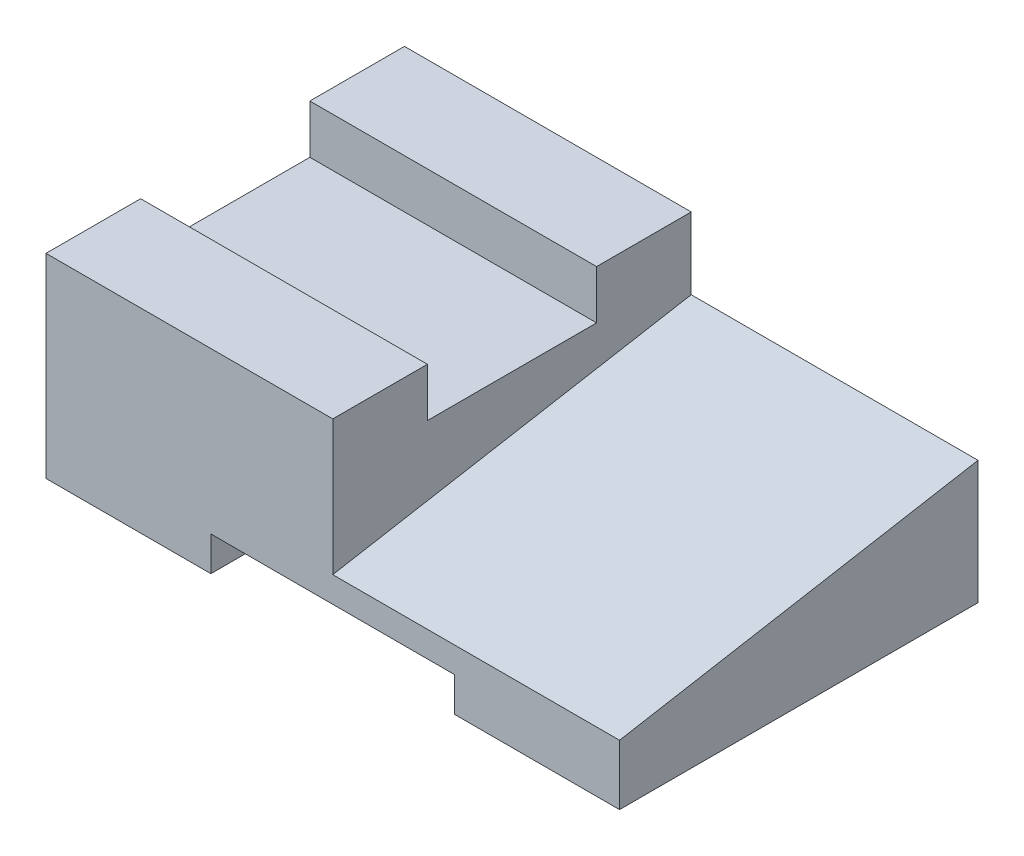
ISO-10303-21;
HEADER;
FILE_DESCRIPTION(('STEP AP214'),'2;1');
FILE_NAME('part.step','',(''),(''),'','','');
FILE_SCHEMA(('AUTOMOTIVE_DESIGN { 1 0 10303 214 1 1 1 1 }'));
ENDSEC;
DATA;
#1=APPLICATION_CONTEXT('core data for automotive mechanical design processes');
#2=APPLICATION_PROTOCOL_DEFINITION('international standard','automotive_design',2000,#1);
#3=PRODUCT_CONTEXT('',#1,'mechanical');
#4=PRODUCT('Part','Part','',(#3));
#5=PRODUCT_RELATED_PRODUCT_CATEGORY('part','',(#4));
#6=PRODUCT_DEFINITION_FORMATION('','',#4);
#7=PRODUCT_DEFINITION_CONTEXT('part definition',#1,'design');
#8=PRODUCT_DEFINITION('design','',#6,#7);
#9=PRODUCT_DEFINITION_SHAPE('','',#8);
#10=(LENGTH_UNIT() NAMED_UNIT(*) SI_UNIT(.MILLI.,.METRE.));
#11=(NAMED_UNIT(*) PLANE_ANGLE_UNIT() SI_UNIT($,.RADIAN.));
#12=(NAMED_UNIT(*) SI_UNIT($,.STERADIAN.) SOLID_ANGLE_UNIT());
#13=UNCERTAINTY_MEASURE_WITH_UNIT(LENGTH_MEASURE(1.E-05),#10,'distance_accuracy_value','');
#14=(GEOMETRIC_REPRESENTATION_CONTEXT(3) GLOBAL_UNCERTAINTY_ASSIGNED_CONTEXT((#13)) GLOBAL_UNIT_ASSIGNED_CONTEXT((#10,
#11,#12)) REPRESENTATION_CONTEXT('',''));
#15=CARTESIAN_POINT('',(0.,0.,0.));
#16=DIRECTION('',(0.,0.,1.));
#17=DIRECTION('',(1.,0.,0.));
#18=AXIS2_PLACEMENT_3D('',#15,#16,#17);
#19=CARTESIAN_POINT('',(-100.,0.,0.));
#20=DIRECTION('',(0.,-1.,0.));
#21=DIRECTION('',(0.,0.,-1.));
#22=AXIS2_PLACEMENT_3D('',#19,#20,#21);
#23=PLANE('',#22);
#24=DIRECTION('',(1.,0.,0.));
#25=VECTOR('',#24,1.);
#26=CARTESIAN_POINT('',(-100.,0.,0.));
#27=LINE('',#26,#25);
#28=CARTESIAN_POINT('',(42.5,0.,0.));
#29=VERTEX_POINT('',#28);
#30=CARTESIAN_POINT('',(100.,0.,0.));
#31=VERTEX_POINT('',#30);
#32=EDGE_CURVE('E287',#29,#31,#27,.T.);
#33=ORIENTED_EDGE('',*,*,#32,.F.);
#34=DIRECTION('',(0.,0.,-1.));
#35=VECTOR('',#34,1.);
#36=CARTESIAN_POINT('',(42.5,0.,348.070896452637));
#37=LINE('',#36,#35);
#38=CARTESIAN_POINT('',(42.5,0.,-125.));
#39=VERTEX_POINT('',#38);
#40=EDGE_CURVE('E211',#29,#39,#37,.T.);
#41=ORIENTED_EDGE('',*,*,#40,.T.);
#42=DIRECTION('',(1.,0.,0.));
#43=VECTOR('',#42,1.);
#44=CARTESIAN_POINT('',(-100.,0.,-125.));
#45=LINE('',#44,#43);
#46=CARTESIAN_POINT('',(100.,0.,-125.));
#47=VERTEX_POINT('',#46);
#48=EDGE_CURVE('E192',#39,#47,#45,.T.);
#49=ORIENTED_EDGE('',*,*,#48,.T.);
#50=DIRECTION('',(0.,0.,-1.));
#51=VECTOR('',#50,1.);
#52=CARTESIAN_POINT('',(100.,0.,0.));
#53=LINE('',#52,#51);
#54=EDGE_CURVE('E228',#31,#47,#53,.T.);
#55=ORIENTED_EDGE('',*,*,#54,.F.);
#56=EDGE_LOOP('',(#33,#41,#49,#55));
#57=FACE_BOUND('',#56,.T.);
#58=ADVANCED_FACE('F87',(#57),#23,.T.);
#59=CARTESIAN_POINT('',(-100.,0.,0.));
#60=DIRECTION('',(0.,0.,1.));
#61=DIRECTION('',(0.,-1.,0.));
#62=AXIS2_PLACEMENT_3D('',#59,#60,#61);
#63=PLANE('',#62);
#64=DIRECTION('',(1.,0.,0.));
#65=VECTOR('',#64,1.);
#66=CARTESIAN_POINT('',(-42.5,12.,0.));
#67=LINE('',#66,#65);
#68=CARTESIAN_POINT('',(-42.5,12.,0.));
#69=VERTEX_POINT('',#68);
#70=CARTESIAN_POINT('',(42.5,12.,0.));
#71=VERTEX_POINT('',#70);
#72=EDGE_CURVE('E107',#69,#71,#67,.T.);
#73=ORIENTED_EDGE('',*,*,#72,.T.);
#74=DIRECTION('',(0.,-1.,0.));
#75=VECTOR('',#74,1.);
#76=CARTESIAN_POINT('',(42.5,12.,0.));
#77=LINE('',#76,#75);
#78=EDGE_CURVE('E209',#71,#29,#77,.T.);
#79=ORIENTED_EDGE('',*,*,#78,.T.);
#80=ORIENTED_EDGE('',*,*,#32,.T.);
#81=DIRECTION('',(0.,-1.,0.));
#82=VECTOR('',#81,1.);
#83=CARTESIAN_POINT('',(100.,0.,0.));
#84=LINE('',#83,#82);
#85=CARTESIAN_POINT('',(100.,20.9591274114428,0.));
#86=VERTEX_POINT('',#85);
#87=EDGE_CURVE('E224',#86,#31,#84,.T.);
#88=ORIENTED_EDGE('',*,*,#87,.F.);
#89=DIRECTION('',(-1.,0.,0.));
#90=VECTOR('',#89,1.);
#91=CARTESIAN_POINT('',(100.,20.9591274114428,0.));
#92=LINE('',#91,#90);
#93=CARTESIAN_POINT('',(0.,20.9591274114428,0.));
#94=VERTEX_POINT('',#93);
#95=EDGE_CURVE('E230',#86,#94,#92,.T.);
#96=ORIENTED_EDGE('',*,*,#95,.T.);
#97=DIRECTION('',(0.,-1.,0.));
#98=VECTOR('',#97,1.);
#99=CARTESIAN_POINT('',(0.,0.,0.));
#100=LINE('',#99,#98);
#101=CARTESIAN_POINT('',(0.,68.,0.));
#102=VERTEX_POINT('',#101);
#103=EDGE_CURVE('E244',#102,#94,#100,.T.);
#104=ORIENTED_EDGE('',*,*,#103,.F.);
#105=DIRECTION('',(1.,0.,0.));
#106=VECTOR('',#105,1.);
#107=CARTESIAN_POINT('',(-100.,68.,0.));
#108=LINE('',#107,#106);
#109=CARTESIAN_POINT('',(-100.,68.,0.));
#110=VERTEX_POINT('',#109);
#111=EDGE_CURVE('E12',#110,#102,#108,.T.);
#112=ORIENTED_EDGE('',*,*,#111,.F.);
#113=DIRECTION('',(0.,-1.,0.));
#114=VECTOR('',#113,1.);
#115=CARTESIAN_POINT('',(-100.,0.,0.));
#116=LINE('',#115,#114);
#117=CARTESIAN_POINT('',(-100.,0.,0.));
#118=VERTEX_POINT('',#117);
#119=EDGE_CURVE('E260',#110,#118,#116,.T.);
#120=ORIENTED_EDGE('',*,*,#119,.T.);
#121=CARTESIAN_POINT('',(-42.5,0.,0.));
#122=VERTEX_POINT('',#121);
#123=EDGE_CURVE('E93',#118,#122,#27,.T.);
#124=ORIENTED_EDGE('',*,*,#123,.T.);
#125=DIRECTION('',(0.,1.,0.));
#126=VECTOR('',#125,1.);
#127=CARTESIAN_POINT('',(-42.5,0.,0.));
#128=LINE('',#127,#126);
#129=EDGE_CURVE('E102',#122,#69,#128,.T.);
#130=ORIENTED_EDGE('',*,*,#129,.T.);
#131=EDGE_LOOP('',(#73,#79,#80,#88,#96,#104,#112,#120,#124,#130));
#132=FACE_BOUND('',#131,.T.);
#133=ADVANCED_FACE('F300',(#132),#63,.T.);
#134=CARTESIAN_POINT('',(-100.,68.,0.));
#135=DIRECTION('',(0.,1.,0.));
#136=DIRECTION('',(0.,0.,1.));
#137=AXIS2_PLACEMENT_3D('',#134,#135,#136);
#138=PLANE('',#137);
#139=DIRECTION('',(0.,0.,1.));
#140=VECTOR('',#139,1.);
#141=CARTESIAN_POINT('',(0.,68.,0.));
#142=LINE('',#141,#140);
#143=CARTESIAN_POINT('',(0.,68.,-33.));
#144=VERTEX_POINT('',#143);
#145=EDGE_CURVE('E274',#144,#102,#142,.T.);
#146=ORIENTED_EDGE('',*,*,#145,.F.);
#147=DIRECTION('',(1.,0.,0.));
#148=VECTOR('',#147,1.);
#149=CARTESIAN_POINT('',(-100.,68.,-33.));
#150=LINE('',#149,#148);
#151=CARTESIAN_POINT('',(-100.,68.,-33.));
#152=VERTEX_POINT('',#151);
#153=EDGE_CURVE('E96',#152,#144,#150,.T.);
#154=ORIENTED_EDGE('',*,*,#153,.F.);
#155=DIRECTION('',(0.,0.,1.));
#156=VECTOR('',#155,1.);
#157=CARTESIAN_POINT('',(-100.,68.,0.));
#158=LINE('',#157,#156);
#159=EDGE_CURVE('E255',#152,#110,#158,.T.);
#160=ORIENTED_EDGE('',*,*,#159,.T.);
#161=ORIENTED_EDGE('',*,*,#111,.T.);
#162=EDGE_LOOP('',(#146,#154,#160,#161));
#163=FACE_BOUND('',#162,.T.);
#164=ADVANCED_FACE('F306',(#163),#138,.T.);
#165=CARTESIAN_POINT('',(0.,0.,0.));
#166=DIRECTION('',(1.,0.,0.));
#167=DIRECTION('',(0.,0.,-1.));
#168=AXIS2_PLACEMENT_3D('',#165,#166,#167);
#169=PLANE('',#168);
#170=DIRECTION('',(0.,-0.173648177666924,0.984807753012209));
#171=VECTOR('',#170,1.);
#172=CARTESIAN_POINT('',(0.,20.3271323890436,3.58422188062117));
#173=LINE('',#172,#171);
#174=CARTESIAN_POINT('',(0.,43.,-125.));
#175=VERTEX_POINT('',#174);
#176=EDGE_CURVE('E222',#175,#94,#173,.T.);
#177=ORIENTED_EDGE('',*,*,#176,.F.);
#178=DIRECTION('',(0.,1.,0.));
#179=VECTOR('',#178,1.);
#180=CARTESIAN_POINT('',(0.,0.,-125.));
#181=LINE('',#180,#179);
#182=CARTESIAN_POINT('',(0.,68.,-125.));
#183=VERTEX_POINT('',#182);
#184=EDGE_CURVE('E257',#175,#183,#181,.T.);
#185=ORIENTED_EDGE('',*,*,#184,.T.);
#186=DIRECTION('',(0.,0.,1.));
#187=VECTOR('',#186,1.);
#188=CARTESIAN_POINT('',(0.,68.,0.));
#189=LINE('',#188,#187);
#190=CARTESIAN_POINT('',(0.,68.,-92.));
#191=VERTEX_POINT('',#190);
#192=EDGE_CURVE('E265',#183,#191,#189,.T.);
#193=ORIENTED_EDGE('',*,*,#192,.T.);
#194=DIRECTION('',(0.,-1.,0.));
#195=VECTOR('',#194,1.);
#196=CARTESIAN_POINT('',(0.,0.,-92.));
#197=LINE('',#196,#195);
#198=CARTESIAN_POINT('',(0.,51.,-92.));
#199=VERTEX_POINT('',#198);
#200=EDGE_CURVE('E266',#191,#199,#197,.T.);
#201=ORIENTED_EDGE('',*,*,#200,.T.);
#202=DIRECTION('',(0.,0.,1.));
#203=VECTOR('',#202,1.);
#204=CARTESIAN_POINT('',(0.,51.,0.));
#205=LINE('',#204,#203);
#206=CARTESIAN_POINT('',(0.,51.,-33.));
#207=VERTEX_POINT('',#206);
#208=EDGE_CURVE('E267',#199,#207,#205,.T.);
#209=ORIENTED_EDGE('',*,*,#208,.T.);
#210=DIRECTION('',(0.,1.,0.));
#211=VECTOR('',#210,1.);
#212=CARTESIAN_POINT('',(0.,0.,-33.));
#213=LINE('',#212,#211);
#214=EDGE_CURVE('E275',#207,#144,#213,.T.);
#215=ORIENTED_EDGE('',*,*,#214,.T.);
#216=ORIENTED_EDGE('',*,*,#145,.T.);
#217=ORIENTED_EDGE('',*,*,#103,.T.);
#218=EDGE_LOOP('',(#177,#185,#193,#201,#209,#215,#216,#217));
#219=FACE_BOUND('',#218,.T.);
#220=ADVANCED_FACE('F309',(#219),#169,.T.);
#221=CARTESIAN_POINT('',(-100.,0.,-125.));
#222=DIRECTION('',(0.,0.,-1.));
#223=DIRECTION('',(-1.,0.,0.));
#224=AXIS2_PLACEMENT_3D('',#221,#222,#223);
#225=PLANE('',#224);
#226=DIRECTION('',(0.,1.,0.));
#227=VECTOR('',#226,1.);
#228=CARTESIAN_POINT('',(-42.5,0.,-125.));
#229=LINE('',#228,#227);
#230=CARTESIAN_POINT('',(-42.5,0.,-125.));
#231=VERTEX_POINT('',#230);
#232=CARTESIAN_POINT('',(-42.5,12.,-125.));
#233=VERTEX_POINT('',#232);
#234=EDGE_CURVE('E210',#231,#233,#229,.T.);
#235=ORIENTED_EDGE('',*,*,#234,.F.);
#236=CARTESIAN_POINT('',(-100.,0.,-125.));
#237=VERTEX_POINT('',#236);
#238=EDGE_CURVE('E263',#237,#231,#45,.T.);
#239=ORIENTED_EDGE('',*,*,#238,.F.);
#240=DIRECTION('',(0.,1.,0.));
#241=VECTOR('',#240,1.);
#242=CARTESIAN_POINT('',(-100.,0.,-125.));
#243=LINE('',#242,#241);
#244=CARTESIAN_POINT('',(-100.,68.,-125.));
#245=VERTEX_POINT('',#244);
#246=EDGE_CURVE('E236',#237,#245,#243,.T.);
#247=ORIENTED_EDGE('',*,*,#246,.T.);
#248=DIRECTION('',(1.,0.,0.));
#249=VECTOR('',#248,1.);
#250=CARTESIAN_POINT('',(-100.,68.,-125.));
#251=LINE('',#250,#249);
#252=EDGE_CURVE('E259',#245,#183,#251,.T.);
#253=ORIENTED_EDGE('',*,*,#252,.T.);
#254=ORIENTED_EDGE('',*,*,#184,.F.);
#255=DIRECTION('',(-1.,0.,0.));
#256=VECTOR('',#255,1.);
#257=CARTESIAN_POINT('',(100.,43.,-125.));
#258=LINE('',#257,#256);
#259=CARTESIAN_POINT('',(100.,43.,-125.));
#260=VERTEX_POINT('',#259);
#261=EDGE_CURVE('E232',#260,#175,#258,.T.);
#262=ORIENTED_EDGE('',*,*,#261,.F.);
#263=DIRECTION('',(0.,1.,0.));
#264=VECTOR('',#263,1.);
#265=CARTESIAN_POINT('',(100.,0.,-125.));
#266=LINE('',#265,#264);
#267=EDGE_CURVE('E220',#47,#260,#266,.T.);
#268=ORIENTED_EDGE('',*,*,#267,.F.);
#269=ORIENTED_EDGE('',*,*,#48,.F.);
#270=DIRECTION('',(0.,-1.,0.));
#271=VECTOR('',#270,1.);
#272=CARTESIAN_POINT('',(42.5,12.,-125.));
#273=LINE('',#272,#271);
#274=CARTESIAN_POINT('',(42.5,12.,-125.));
#275=VERTEX_POINT('',#274);
#276=EDGE_CURVE('E187',#275,#39,#273,.T.);
#277=ORIENTED_EDGE('',*,*,#276,.F.);
#278=DIRECTION('',(1.,0.,0.));
#279=VECTOR('',#278,1.);
#280=CARTESIAN_POINT('',(-42.5,12.,-125.));
#281=LINE('',#280,#279);
#282=EDGE_CURVE('E193',#233,#275,#281,.T.);
#283=ORIENTED_EDGE('',*,*,#282,.F.);
#284=EDGE_LOOP('',(#235,#239,#247,#253,#254,#262,#268,#269,#277,#283));
#285=FACE_BOUND('',#284,.T.);
#286=ADVANCED_FACE('F186',(#285),#225,.T.);
#287=CARTESIAN_POINT('',(-100.,68.,0.));
#288=DIRECTION('',(0.,1.,0.));
#289=DIRECTION('',(0.,0.,1.));
#290=AXIS2_PLACEMENT_3D('',#287,#288,#289);
#291=PLANE('',#290);
#292=ORIENTED_EDGE('',*,*,#192,.F.);
#293=ORIENTED_EDGE('',*,*,#252,.F.);
#294=DIRECTION('',(0.,0.,1.));
#295=VECTOR('',#294,1.);
#296=CARTESIAN_POINT('',(-100.,68.,0.));
#297=LINE('',#296,#295);
#298=CARTESIAN_POINT('',(-100.,68.,-92.));
#299=VERTEX_POINT('',#298);
#300=EDGE_CURVE('E243',#245,#299,#297,.T.);
#301=ORIENTED_EDGE('',*,*,#300,.T.);
#302=DIRECTION('',(1.,0.,0.));
#303=VECTOR('',#302,1.);
#304=CARTESIAN_POINT('',(-100.,68.,-92.));
#305=LINE('',#304,#303);
#306=EDGE_CURVE('E285',#299,#191,#305,.T.);
#307=ORIENTED_EDGE('',*,*,#306,.T.);
#308=EDGE_LOOP('',(#292,#293,#301,#307));
#309=FACE_BOUND('',#308,.T.);
#310=ADVANCED_FACE('F340',(#309),#291,.T.);
#311=CARTESIAN_POINT('',(-100.,0.,-92.));
#312=DIRECTION('',(0.,0.,1.));
#313=DIRECTION('',(1.,0.,0.));
#314=AXIS2_PLACEMENT_3D('',#311,#312,#313);
#315=PLANE('',#314);
#316=ORIENTED_EDGE('',*,*,#200,.F.);
#317=ORIENTED_EDGE('',*,*,#306,.F.);
#318=DIRECTION('',(0.,-1.,0.));
#319=VECTOR('',#318,1.);
#320=CARTESIAN_POINT('',(-100.,0.,-92.));
#321=LINE('',#320,#319);
#322=CARTESIAN_POINT('',(-100.,51.,-92.));
#323=VERTEX_POINT('',#322);
#324=EDGE_CURVE('E241',#299,#323,#321,.T.);
#325=ORIENTED_EDGE('',*,*,#324,.T.);
#326=DIRECTION('',(1.,0.,0.));
#327=VECTOR('',#326,1.);
#328=CARTESIAN_POINT('',(-100.,51.,-92.));
#329=LINE('',#328,#327);
#330=EDGE_CURVE('E284',#323,#199,#329,.T.);
#331=ORIENTED_EDGE('',*,*,#330,.T.);
#332=EDGE_LOOP('',(#316,#317,#325,#331));
#333=FACE_BOUND('',#332,.T.);
#334=ADVANCED_FACE('F355',(#333),#315,.T.);
#335=CARTESIAN_POINT('',(-100.,51.,0.));
#336=DIRECTION('',(0.,1.,0.));
#337=DIRECTION('',(0.,0.,1.));
#338=AXIS2_PLACEMENT_3D('',#335,#336,#337);
#339=PLANE('',#338);
#340=ORIENTED_EDGE('',*,*,#208,.F.);
#341=ORIENTED_EDGE('',*,*,#330,.F.);
#342=DIRECTION('',(0.,0.,1.));
#343=VECTOR('',#342,1.);
#344=CARTESIAN_POINT('',(-100.,51.,0.));
#345=LINE('',#344,#343);
#346=CARTESIAN_POINT('',(-100.,51.,-33.));
#347=VERTEX_POINT('',#346);
#348=EDGE_CURVE('E246',#323,#347,#345,.T.);
#349=ORIENTED_EDGE('',*,*,#348,.T.);
#350=DIRECTION('',(1.,0.,0.));
#351=VECTOR('',#350,1.);
#352=CARTESIAN_POINT('',(-100.,51.,-33.));
#353=LINE('',#352,#351);
#354=EDGE_CURVE('E278',#347,#207,#353,.T.);
#355=ORIENTED_EDGE('',*,*,#354,.T.);
#356=EDGE_LOOP('',(#340,#341,#349,#355));
#357=FACE_BOUND('',#356,.T.);
#358=ADVANCED_FACE('F354',(#357),#339,.T.);
#359=CARTESIAN_POINT('',(-100.,0.,-33.));
#360=DIRECTION('',(0.,0.,-1.));
#361=DIRECTION('',(-1.,0.,0.));
#362=AXIS2_PLACEMENT_3D('',#359,#360,#361);
#363=PLANE('',#362);
#364=ORIENTED_EDGE('',*,*,#214,.F.);
#365=ORIENTED_EDGE('',*,*,#354,.F.);
#366=DIRECTION('',(0.,1.,0.));
#367=VECTOR('',#366,1.);
#368=CARTESIAN_POINT('',(-100.,0.,-33.));
#369=LINE('',#368,#367);
#370=EDGE_CURVE('E253',#347,#152,#369,.T.);
#371=ORIENTED_EDGE('',*,*,#370,.T.);
#372=ORIENTED_EDGE('',*,*,#153,.T.);
#373=EDGE_LOOP('',(#364,#365,#371,#372));
#374=FACE_BOUND('',#373,.T.);
#375=ADVANCED_FACE('F325',(#374),#363,.T.);
#376=CARTESIAN_POINT('',(-100.,0.,0.));
#377=DIRECTION('',(1.,0.,0.));
#378=DIRECTION('',(0.,0.,-1.));
#379=AXIS2_PLACEMENT_3D('',#376,#377,#378);
#380=PLANE('',#379);
#381=ORIENTED_EDGE('',*,*,#246,.F.);
#382=DIRECTION('',(0.,0.,-1.));
#383=VECTOR('',#382,1.);
#384=CARTESIAN_POINT('',(-100.,0.,0.));
#385=LINE('',#384,#383);
#386=EDGE_CURVE('E240',#118,#237,#385,.T.);
#387=ORIENTED_EDGE('',*,*,#386,.F.);
#388=ORIENTED_EDGE('',*,*,#119,.F.);
#389=ORIENTED_EDGE('',*,*,#159,.F.);
#390=ORIENTED_EDGE('',*,*,#370,.F.);
#391=ORIENTED_EDGE('',*,*,#348,.F.);
#392=ORIENTED_EDGE('',*,*,#324,.F.);
#393=ORIENTED_EDGE('',*,*,#300,.F.);
#394=EDGE_LOOP('',(#381,#387,#388,#389,#390,#391,#392,#393));
#395=FACE_BOUND('',#394,.T.);
#396=ADVANCED_FACE('F311',(#395),#380,.F.);
#397=DIRECTION('',(0.,0.,-1.));
#398=VECTOR('',#397,1.);
#399=CARTESIAN_POINT('',(-42.5,0.,348.070896452637));
#400=LINE('',#399,#398);
#401=EDGE_CURVE('E196',#122,#231,#400,.T.);
#402=ORIENTED_EDGE('',*,*,#401,.F.);
#403=ORIENTED_EDGE('',*,*,#123,.F.);
#404=ORIENTED_EDGE('',*,*,#386,.T.);
#405=ORIENTED_EDGE('',*,*,#238,.T.);
#406=EDGE_LOOP('',(#402,#403,#404,#405));
#407=FACE_BOUND('',#406,.T.);
#408=ADVANCED_FACE('F90',(#407),#23,.T.);
#409=CARTESIAN_POINT('',(100.,20.3271323890436,3.58422188062117));
#410=DIRECTION('',(0.,-0.984807753012209,-0.173648177666924));
#411=DIRECTION('',(0.,0.173648177666924,-0.984807753012209));
#412=AXIS2_PLACEMENT_3D('',#409,#410,#411);
#413=PLANE('',#412);
#414=ORIENTED_EDGE('',*,*,#176,.T.);
#415=ORIENTED_EDGE('',*,*,#95,.F.);
#416=DIRECTION('',(0.,-0.173648177666924,0.984807753012209));
#417=VECTOR('',#416,1.);
#418=CARTESIAN_POINT('',(100.,20.3271323890436,3.58422188062117));
#419=LINE('',#418,#417);
#420=EDGE_CURVE('E219',#260,#86,#419,.T.);
#421=ORIENTED_EDGE('',*,*,#420,.F.);
#422=ORIENTED_EDGE('',*,*,#261,.T.);
#423=EDGE_LOOP('',(#414,#415,#421,#422));
#424=FACE_BOUND('',#423,.T.);
#425=ADVANCED_FACE('F315',(#424),#413,.F.);
#426=CARTESIAN_POINT('',(100.,0.,0.));
#427=DIRECTION('',(1.,0.,0.));
#428=DIRECTION('',(0.,0.,-1.));
#429=AXIS2_PLACEMENT_3D('',#426,#427,#428);
#430=PLANE('',#429);
#431=ORIENTED_EDGE('',*,*,#267,.T.);
#432=ORIENTED_EDGE('',*,*,#420,.T.);
#433=ORIENTED_EDGE('',*,*,#87,.T.);
#434=ORIENTED_EDGE('',*,*,#54,.T.);
#435=EDGE_LOOP('',(#431,#432,#433,#434));
#436=FACE_BOUND('',#435,.T.);
#437=ADVANCED_FACE('F303',(#436),#430,.T.);
#438=CARTESIAN_POINT('',(42.5,12.,348.070896452637));
#439=DIRECTION('',(1.,0.,0.));
#440=DIRECTION('',(0.,0.,-1.));
#441=AXIS2_PLACEMENT_3D('',#438,#439,#440);
#442=PLANE('',#441);
#443=DIRECTION('',(0.,0.,-1.));
#444=VECTOR('',#443,1.);
#445=CARTESIAN_POINT('',(42.5,12.,348.070896452637));
#446=LINE('',#445,#444);
#447=EDGE_CURVE('E204',#71,#275,#446,.T.);
#448=ORIENTED_EDGE('',*,*,#447,.T.);
#449=ORIENTED_EDGE('',*,*,#276,.T.);
#450=ORIENTED_EDGE('',*,*,#40,.F.);
#451=ORIENTED_EDGE('',*,*,#78,.F.);
#452=EDGE_LOOP('',(#448,#449,#450,#451));
#453=FACE_BOUND('',#452,.T.);
#454=ADVANCED_FACE('F207',(#453),#442,.F.);
#455=CARTESIAN_POINT('',(-42.5,12.,348.070896452637));
#456=DIRECTION('',(0.,1.,0.));
#457=DIRECTION('',(0.,0.,1.));
#458=AXIS2_PLACEMENT_3D('',#455,#456,#457);
#459=PLANE('',#458);
#460=DIRECTION('',(0.,0.,-1.));
#461=VECTOR('',#460,1.);
#462=CARTESIAN_POINT('',(-42.5,12.,348.070896452637));
#463=LINE('',#462,#461);
#464=EDGE_CURVE('E206',#69,#233,#463,.T.);
#465=ORIENTED_EDGE('',*,*,#464,.T.);
#466=ORIENTED_EDGE('',*,*,#282,.T.);
#467=ORIENTED_EDGE('',*,*,#447,.F.);
#468=ORIENTED_EDGE('',*,*,#72,.F.);
#469=EDGE_LOOP('',(#465,#466,#467,#468));
#470=FACE_BOUND('',#469,.T.);
#471=ADVANCED_FACE('F201',(#470),#459,.F.);
#472=CARTESIAN_POINT('',(-42.5,0.,348.070896452637));
#473=DIRECTION('',(-1.,0.,0.));
#474=DIRECTION('',(0.,-1.,0.));
#475=AXIS2_PLACEMENT_3D('',#472,#473,#474);
#476=PLANE('',#475);
#477=ORIENTED_EDGE('',*,*,#401,.T.);
#478=ORIENTED_EDGE('',*,*,#234,.T.);
#479=ORIENTED_EDGE('',*,*,#464,.F.);
#480=ORIENTED_EDGE('',*,*,#129,.F.);
#481=EDGE_LOOP('',(#477,#478,#479,#480));
#482=FACE_BOUND('',#481,.T.);
#483=ADVANCED_FACE('F332',(#482),#476,.F.);
#484=CLOSED_SHELL('',(#58,#133,#164,#220,#286,#310,#334,#358,#375,#396,#408,#425,#437,#454,#471,#483));
#485=MANIFOLD_SOLID_BREP('B2',#484);
#486=ADVANCED_BREP_SHAPE_REPRESENTATION('',(#18,#485),#14);
#487=SHAPE_DEFINITION_REPRESENTATION(#9,#486);
ENDSEC;
END-ISO-10303-21;
